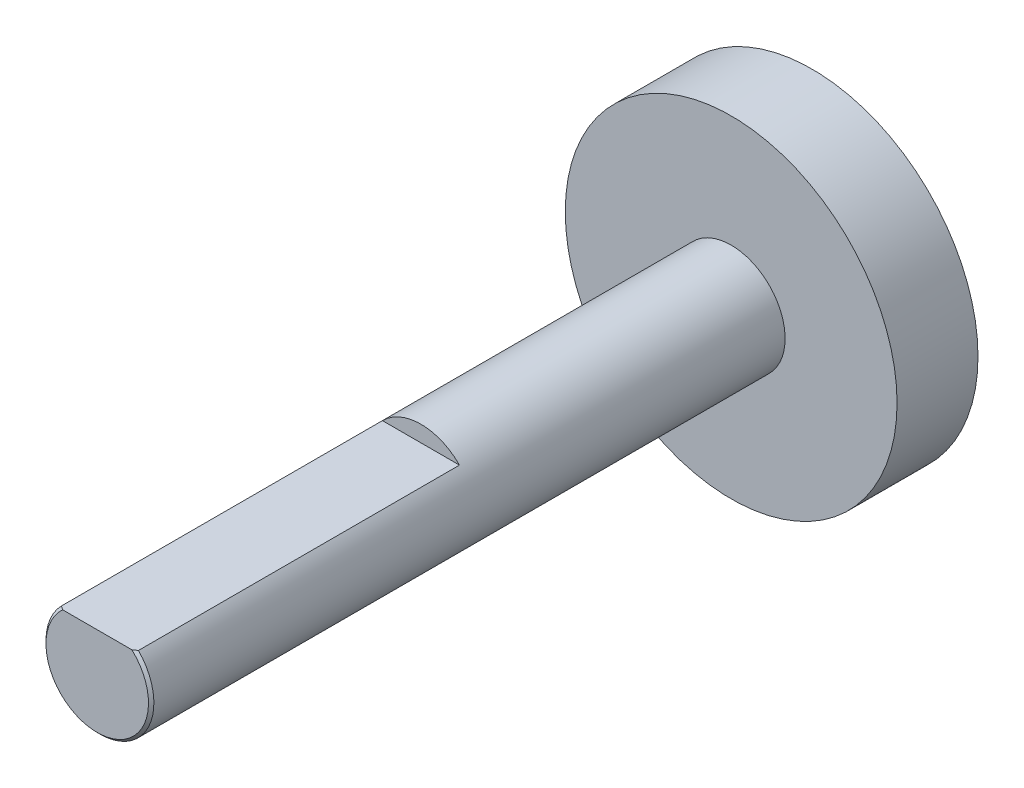
ISO-10303-21;
HEADER;
FILE_DESCRIPTION(('STEP AP214'),'2;1');
FILE_NAME('part.step','',(''),(''),'','','');
FILE_SCHEMA(('AUTOMOTIVE_DESIGN { 1 0 10303 214 1 1 1 1 }'));
ENDSEC;
DATA;
#1=APPLICATION_CONTEXT('core data for automotive mechanical design processes');
#2=APPLICATION_PROTOCOL_DEFINITION('international standard','automotive_design',2000,#1);
#3=PRODUCT_CONTEXT('',#1,'mechanical');
#4=PRODUCT('Part','Part','',(#3));
#5=PRODUCT_RELATED_PRODUCT_CATEGORY('part','',(#4));
#6=PRODUCT_DEFINITION_FORMATION('','',#4);
#7=PRODUCT_DEFINITION_CONTEXT('part definition',#1,'design');
#8=PRODUCT_DEFINITION('design','',#6,#7);
#9=PRODUCT_DEFINITION_SHAPE('','',#8);
#10=(LENGTH_UNIT() NAMED_UNIT(*) SI_UNIT(.MILLI.,.METRE.));
#11=(NAMED_UNIT(*) PLANE_ANGLE_UNIT() SI_UNIT($,.RADIAN.));
#12=(NAMED_UNIT(*) SI_UNIT($,.STERADIAN.) SOLID_ANGLE_UNIT());
#13=UNCERTAINTY_MEASURE_WITH_UNIT(LENGTH_MEASURE(1.E-05),#10,'distance_accuracy_value','');
#14=(GEOMETRIC_REPRESENTATION_CONTEXT(3) GLOBAL_UNCERTAINTY_ASSIGNED_CONTEXT((#13)) GLOBAL_UNIT_ASSIGNED_CONTEXT((#10,
#11,#12)) REPRESENTATION_CONTEXT('',''));
#15=CARTESIAN_POINT('',(0.,0.,0.));
#16=DIRECTION('',(0.,0.,1.));
#17=DIRECTION('',(1.,0.,0.));
#18=AXIS2_PLACEMENT_3D('',#15,#16,#17);
#19=CARTESIAN_POINT('',(0.,0.,-26.5));
#20=DIRECTION('',(0.,0.,1.));
#21=DIRECTION('',(1.,0.,0.));
#22=AXIS2_PLACEMENT_3D('',#19,#20,#21);
#23=CYLINDRICAL_SURFACE('',#22,2.);
#24=DIRECTION('',(0.,0.,1.));
#25=VECTOR('',#24,1.);
#26=CARTESIAN_POINT('',(1.42828568570857,1.4,-12.));
#27=LINE('',#26,#25);
#28=CARTESIAN_POINT('',(1.42828568570857,1.4,-12.));
#29=VERTEX_POINT('',#28);
#30=CARTESIAN_POINT('',(1.42828568570857,1.4,-0.0999999999999993));
#31=VERTEX_POINT('',#30);
#32=EDGE_CURVE('E80',#29,#31,#27,.T.);
#33=ORIENTED_EDGE('',*,*,#32,.T.);
#34=CARTESIAN_POINT('',(0.,0.,-0.0999999999999994));
#35=DIRECTION('',(0.,0.,1.));
#36=DIRECTION('',(1.,0.,0.));
#37=AXIS2_PLACEMENT_3D('',#34,#35,#36);
#38=CIRCLE('',#37,2.);
#39=CARTESIAN_POINT('',(-1.42828568570857,1.4,-0.0999999999999993));
#40=VERTEX_POINT('',#39);
#41=EDGE_CURVE('E85',#31,#40,#38,.F.);
#42=ORIENTED_EDGE('',*,*,#41,.T.);
#43=DIRECTION('',(0.,0.,1.));
#44=VECTOR('',#43,1.);
#45=CARTESIAN_POINT('',(-1.42828568570857,1.4,-12.));
#46=LINE('',#45,#44);
#47=CARTESIAN_POINT('',(-1.42828568570857,1.4,-12.));
#48=VERTEX_POINT('',#47);
#49=EDGE_CURVE('E78',#48,#40,#46,.T.);
#50=ORIENTED_EDGE('',*,*,#49,.F.);
#51=CARTESIAN_POINT('',(0.,0.,-12.));
#52=DIRECTION('',(0.,0.,1.));
#53=DIRECTION('',(1.,0.,0.));
#54=AXIS2_PLACEMENT_3D('',#51,#52,#53);
#55=CIRCLE('',#54,2.);
#56=EDGE_CURVE('E70',#29,#48,#55,.T.);
#57=ORIENTED_EDGE('',*,*,#56,.F.);
#58=EDGE_LOOP('',(#33,#42,#50,#57));
#59=FACE_BOUND('',#58,.T.);
#60=CARTESIAN_POINT('',(0.,0.,-23.5));
#61=DIRECTION('',(0.,0.,-1.));
#62=DIRECTION('',(-1.,0.,0.));
#63=AXIS2_PLACEMENT_3D('',#60,#61,#62);
#64=CIRCLE('',#63,2.);
#65=CARTESIAN_POINT('',(-2.,0.,-23.5));
#66=VERTEX_POINT('',#65);
#67=EDGE_CURVE('E94',#66,#66,#64,.F.);
#68=ORIENTED_EDGE('',*,*,#67,.T.);
#69=EDGE_LOOP('',(#68));
#70=FACE_BOUND('',#69,.T.);
#71=ADVANCED_FACE('F33',(#59,#70),#23,.T.);
#72=CARTESIAN_POINT('',(0.,0.,0.));
#73=DIRECTION('',(0.,0.,1.));
#74=DIRECTION('',(1.,0.,0.));
#75=AXIS2_PLACEMENT_3D('',#72,#73,#74);
#76=PLANE('',#75);
#77=DIRECTION('',(1.,0.,0.));
#78=VECTOR('',#77,1.);
#79=CARTESIAN_POINT('',(1.42828568570857,1.4,0.));
#80=LINE('',#79,#78);
#81=CARTESIAN_POINT('',(-1.28452325786652,1.4,0.));
#82=VERTEX_POINT('',#81);
#83=CARTESIAN_POINT('',(1.28452325786652,1.4,0.));
#84=VERTEX_POINT('',#83);
#85=EDGE_CURVE('E53',#82,#84,#80,.T.);
#86=ORIENTED_EDGE('',*,*,#85,.F.);
#87=CARTESIAN_POINT('',(0.,0.,0.));
#88=DIRECTION('',(0.,0.,1.));
#89=DIRECTION('',(1.,0.,0.));
#90=AXIS2_PLACEMENT_3D('',#87,#88,#89);
#91=CIRCLE('',#90,1.90000000000001);
#92=EDGE_CURVE('E99',#82,#84,#91,.T.);
#93=ORIENTED_EDGE('',*,*,#92,.T.);
#94=EDGE_LOOP('',(#86,#93));
#95=FACE_BOUND('',#94,.T.);
#96=ADVANCED_FACE('F103',(#95),#76,.T.);
#97=CARTESIAN_POINT('',(0.,0.,-23.5));
#98=DIRECTION('',(0.,0.,-1.));
#99=DIRECTION('',(-1.,0.,0.));
#100=AXIS2_PLACEMENT_3D('',#97,#98,#99);
#101=CYLINDRICAL_SURFACE('',#100,6.15);
#102=CARTESIAN_POINT('',(0.,0.,-23.5));
#103=DIRECTION('',(0.,0.,-1.));
#104=DIRECTION('',(-1.,0.,0.));
#105=AXIS2_PLACEMENT_3D('',#102,#103,#104);
#106=CIRCLE('',#105,6.15);
#107=CARTESIAN_POINT('',(-6.15,0.,-23.5));
#108=VERTEX_POINT('',#107);
#109=EDGE_CURVE('E91',#108,#108,#106,.T.);
#110=ORIENTED_EDGE('',*,*,#109,.T.);
#111=EDGE_LOOP('',(#110));
#112=FACE_BOUND('',#111,.T.);
#113=CARTESIAN_POINT('',(0.,0.,-26.5));
#114=DIRECTION('',(0.,0.,-1.));
#115=DIRECTION('',(-1.,0.,0.));
#116=AXIS2_PLACEMENT_3D('',#113,#114,#115);
#117=CIRCLE('',#116,6.15);
#118=CARTESIAN_POINT('',(-6.15,0.,-26.5));
#119=VERTEX_POINT('',#118);
#120=EDGE_CURVE('E87',#119,#119,#117,.T.);
#121=ORIENTED_EDGE('',*,*,#120,.F.);
#122=EDGE_LOOP('',(#121));
#123=FACE_BOUND('',#122,.T.);
#124=ADVANCED_FACE('F118',(#112,#123),#101,.T.);
#125=CARTESIAN_POINT('',(0.,0.,-23.5));
#126=DIRECTION('',(0.,0.,-1.));
#127=DIRECTION('',(-1.,0.,0.));
#128=AXIS2_PLACEMENT_3D('',#125,#126,#127);
#129=PLANE('',#128);
#130=ORIENTED_EDGE('',*,*,#67,.F.);
#131=EDGE_LOOP('',(#130));
#132=FACE_BOUND('',#131,.T.);
#133=ORIENTED_EDGE('',*,*,#109,.F.);
#134=EDGE_LOOP('',(#133));
#135=FACE_BOUND('',#134,.T.);
#136=ADVANCED_FACE('F111',(#132,#135),#129,.F.);
#137=CARTESIAN_POINT('',(0.,0.,-26.5));
#138=DIRECTION('',(0.,0.,1.));
#139=DIRECTION('',(1.,0.,0.));
#140=AXIS2_PLACEMENT_3D('',#137,#138,#139);
#141=PLANE('',#140);
#142=ORIENTED_EDGE('',*,*,#120,.T.);
#143=EDGE_LOOP('',(#142));
#144=FACE_BOUND('',#143,.T.);
#145=ADVANCED_FACE('F106',(#144),#141,.F.);
#146=CARTESIAN_POINT('',(0.,0.,0.));
#147=DIRECTION('',(0.,0.,-1.));
#148=DIRECTION('',(-1.,0.,0.));
#149=AXIS2_PLACEMENT_3D('',#146,#147,#148);
#150=CONICAL_SURFACE('',#149,1.90000000000001,0.785398163397422);
#151=CARTESIAN_POINT('',(-3.14347839706334,1.4,-1.54114173390235));
#152=CARTESIAN_POINT('',(-3.05112096496917,1.4,-1.45679888622006));
#153=CARTESIAN_POINT('',(-2.95847888859827,1.4,-1.3727628286798));
#154=CARTESIAN_POINT('',(-2.77238583928672,1.4,-1.2055449787164));
#155=CARTESIAN_POINT('',(-2.67893467011971,1.4,-1.12236340486775));
#156=CARTESIAN_POINT('',(-2.49036200645134,1.4,-0.956550452847079));
#157=CARTESIAN_POINT('',(-2.3952333610684,1.4,-0.873927186606667));
#158=CARTESIAN_POINT('',(-2.20363430898838,1.4,-0.710270417824567));
#159=CARTESIAN_POINT('',(-2.10716408036376,1.4,-0.629236707673923));
#160=CARTESIAN_POINT('',(-1.92744202260877,1.4,-0.481768415679835));
#161=CARTESIAN_POINT('',(-1.8444533300791,1.4,-0.415014206884));
#162=CARTESIAN_POINT('',(-1.6767333077421,1.4,-0.283736212493794));
#163=CARTESIAN_POINT('',(-1.59200216215226,1.4,-0.219212193030923));
#164=CARTESIAN_POINT('',(-1.42028412472871,1.4,-0.0934352139464291));
#165=CARTESIAN_POINT('',(-1.33330007110713,1.4,-0.0321784101801738));
#166=CARTESIAN_POINT('',(-1.15615966285798,1.4,0.0855252669344848));
#167=CARTESIAN_POINT('',(-1.06600536637348,1.4,0.141975182367396));
#168=CARTESIAN_POINT('',(-0.88354541106649,1.4,0.24617102171911));
#169=CARTESIAN_POINT('',(-0.791340987443907,1.4,0.294091155622805));
#170=CARTESIAN_POINT('',(-0.601729447214468,1.4,0.378506570670471));
#171=CARTESIAN_POINT('',(-0.504332783404056,1.4,0.415023861044787));
#172=CARTESIAN_POINT('',(-0.364225297375769,1.4,0.4539147684972));
#173=CARTESIAN_POINT('',(-0.323552347278584,1.4,0.463661320129813));
#174=CARTESIAN_POINT('',(-0.241567627688535,1.4,0.479879230888071));
#175=CARTESIAN_POINT('',(-0.200256190631947,1.4,0.486352238906068));
#176=CARTESIAN_POINT('',(-0.11731001531327,1.4,0.495696684004794));
#177=CARTESIAN_POINT('',(-0.0756761322087768,1.4,0.498575612926163));
#178=CARTESIAN_POINT('',(0.00768391020491488,1.4,0.500598983331638));
#179=CARTESIAN_POINT('',(0.0494100693003446,1.4,0.4997434334581));
#180=CARTESIAN_POINT('',(0.132555919843665,1.4,0.494350007243296));
#181=CARTESIAN_POINT('',(0.173975981473313,1.4,0.489817745520058));
#182=CARTESIAN_POINT('',(0.256295599223593,1.4,0.477315573447514));
#183=CARTESIAN_POINT('',(0.297195036149329,1.4,0.469344889956977));
#184=CARTESIAN_POINT('',(0.378376425545014,1.4,0.450308468096292));
#185=CARTESIAN_POINT('',(0.418656382495218,1.4,0.439234321606751));
#186=CARTESIAN_POINT('',(0.498374256020695,1.4,0.41442130078832));
#187=CARTESIAN_POINT('',(0.537812201476845,1.4,0.400682518019608));
#188=CARTESIAN_POINT('',(0.678698398078648,1.4,0.347026467550284));
#189=CARTESIAN_POINT('',(0.777664904482014,1.4,0.300599502058126));
#190=CARTESIAN_POINT('',(0.97067679049317,1.4,0.198385711408875));
#191=CARTESIAN_POINT('',(1.0647094746084,1.4,0.142576157801691));
#192=CARTESIAN_POINT('',(1.24998741922185,1.4,0.0245432214084488));
#193=CARTESIAN_POINT('',(1.34119378281718,1.4,-0.0377405372222751));
#194=CARTESIAN_POINT('',(1.52085596035849,1.4,-0.166173638171435));
#195=CARTESIAN_POINT('',(1.60931069250247,1.4,-0.232324472120975));
#196=CARTESIAN_POINT('',(1.8248429083882,1.4,-0.398557918902827));
#197=CARTESIAN_POINT('',(1.95076938491526,1.4,-0.500125166224821));
#198=CARTESIAN_POINT('',(2.19988337139869,1.4,-0.706662063142067));
#199=CARTESIAN_POINT('',(2.32306934092238,1.4,-0.81163354865475));
#200=CARTESIAN_POINT('',(2.56317575995757,1.4,-1.02000795559587));
#201=CARTESIAN_POINT('',(2.68016321887854,1.4,-1.12333386496817));
#202=CARTESIAN_POINT('',(2.8546295120902,1.4,-1.27934589869028));
#203=CARTESIAN_POINT('',(2.91258955702531,1.4,-1.33149638977334));
#204=CARTESIAN_POINT('',(3.0282314952468,1.4,-1.4361024693906));
#205=CARTESIAN_POINT('',(3.08591339445573,1.4,-1.48855805137555));
#206=CARTESIAN_POINT('',(3.14347839706334,1.4,-1.54114173390235));
#207=B_SPLINE_CURVE_WITH_KNOTS('',3,(#151,#152,#153,#154,#155,#156,#157,#158,#159,#160,#161,
#162,#163,#164,#165,#166,#167,#168,#169,#170,#171,#172,#173,#174,#175,#176,#177,#178,#179,#180,
#181,#182,#183,#184,#185,#186,#187,#188,#189,#190,#191,#192,#193,#194,#195,#196,#197,#198,#199,
#200,#201,#202,#203,#204,#205,#206),.UNSPECIFIED.,.F.,.F.,(4,2,2,2,2,2,2,2,2,2,2,2,2,2,2,2,2,2,
2,2,2,2,2,2,2,2,2,4),(0.,0.375227587846896,0.750548880422523,1.12853763243722,1.50647668284304,
1.82596472943583,2.14541917067886,2.46448905812265,2.7833554947497,3.09468421210995,
3.40540824902858,3.53076998862644,3.65606852014284,3.78110542898509,3.90614204846625,
4.03098808616748,4.15586221058363,4.28107797895568,4.40628944552208,4.73326703357094,
5.06104841903442,5.39222054498575,5.72352126645381,6.20875878100091,6.69426248614738,
7.1624973723625,7.39640128193576,7.63030018880443),.UNSPECIFIED.);
#208=EDGE_CURVE('E11',#40,#82,#207,.T.);
#209=ORIENTED_EDGE('',*,*,#208,.F.);
#210=ORIENTED_EDGE('',*,*,#41,.F.);
#211=EDGE_CURVE('E38',#84,#31,#207,.T.);
#212=ORIENTED_EDGE('',*,*,#211,.F.);
#213=ORIENTED_EDGE('',*,*,#92,.F.);
#214=EDGE_LOOP('',(#209,#210,#212,#213));
#215=FACE_BOUND('',#214,.T.);
#216=ADVANCED_FACE('F35',(#215),#150,.T.);
#217=CARTESIAN_POINT('',(1.42828568570857,1.4,-12.));
#218=DIRECTION('',(0.,-1.,0.));
#219=DIRECTION('',(0.,0.,-1.));
#220=AXIS2_PLACEMENT_3D('',#217,#218,#219);
#221=PLANE('',#220);
#222=ORIENTED_EDGE('',*,*,#208,.T.);
#223=ORIENTED_EDGE('',*,*,#85,.T.);
#224=ORIENTED_EDGE('',*,*,#211,.T.);
#225=ORIENTED_EDGE('',*,*,#32,.F.);
#226=DIRECTION('',(1.,0.,0.));
#227=VECTOR('',#226,1.);
#228=CARTESIAN_POINT('',(1.42828568570857,1.4,-12.));
#229=LINE('',#228,#227);
#230=EDGE_CURVE('E73',#48,#29,#229,.T.);
#231=ORIENTED_EDGE('',*,*,#230,.F.);
#232=ORIENTED_EDGE('',*,*,#49,.T.);
#233=EDGE_LOOP('',(#222,#223,#224,#225,#231,#232));
#234=FACE_BOUND('',#233,.T.);
#235=ADVANCED_FACE('F77',(#234),#221,.F.);
#236=CARTESIAN_POINT('',(0.,0.,-12.));
#237=DIRECTION('',(0.,0.,1.));
#238=DIRECTION('',(1.,0.,0.));
#239=AXIS2_PLACEMENT_3D('',#236,#237,#238);
#240=PLANE('',#239);
#241=ORIENTED_EDGE('',*,*,#56,.T.);
#242=ORIENTED_EDGE('',*,*,#230,.T.);
#243=EDGE_LOOP('',(#241,#242));
#244=FACE_BOUND('',#243,.T.);
#245=ADVANCED_FACE('F72',(#244),#240,.T.);
#246=CLOSED_SHELL('',(#71,#96,#124,#136,#145,#216,#235,#245));
#247=MANIFOLD_SOLID_BREP('B2',#246);
#248=ADVANCED_BREP_SHAPE_REPRESENTATION('',(#18,#247),#14);
#249=SHAPE_DEFINITION_REPRESENTATION(#9,#248);
ENDSEC;
END-ISO-10303-21;
